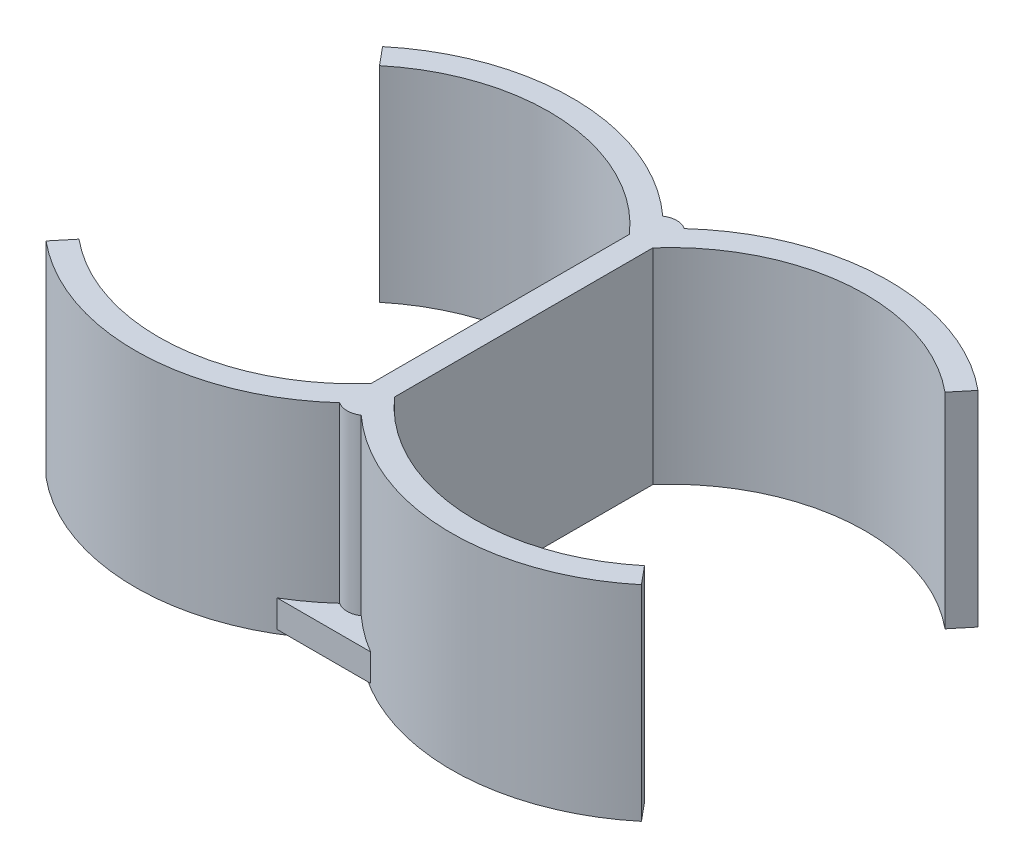
ISO-10303-21;
HEADER;
FILE_DESCRIPTION(('STEP AP214'),'2;1');
FILE_NAME('part.step','',(''),(''),'','','');
FILE_SCHEMA(('AUTOMOTIVE_DESIGN { 1 0 10303 214 1 1 1 1 }'));
ENDSEC;
DATA;
#1=APPLICATION_CONTEXT('core data for automotive mechanical design processes');
#2=APPLICATION_PROTOCOL_DEFINITION('international standard','automotive_design',2000,#1);
#3=PRODUCT_CONTEXT('',#1,'mechanical');
#4=PRODUCT('Part','Part','',(#3));
#5=PRODUCT_RELATED_PRODUCT_CATEGORY('part','',(#4));
#6=PRODUCT_DEFINITION_FORMATION('','',#4);
#7=PRODUCT_DEFINITION_CONTEXT('part definition',#1,'design');
#8=PRODUCT_DEFINITION('design','',#6,#7);
#9=PRODUCT_DEFINITION_SHAPE('','',#8);
#10=(LENGTH_UNIT() NAMED_UNIT(*) SI_UNIT(.MILLI.,.METRE.));
#11=(NAMED_UNIT(*) PLANE_ANGLE_UNIT() SI_UNIT($,.RADIAN.));
#12=(NAMED_UNIT(*) SI_UNIT($,.STERADIAN.) SOLID_ANGLE_UNIT());
#13=UNCERTAINTY_MEASURE_WITH_UNIT(LENGTH_MEASURE(1.E-05),#10,'distance_accuracy_value','');
#14=(GEOMETRIC_REPRESENTATION_CONTEXT(3) GLOBAL_UNCERTAINTY_ASSIGNED_CONTEXT((#13)) GLOBAL_UNIT_ASSIGNED_CONTEXT((#10,
#11,#12)) REPRESENTATION_CONTEXT('',''));
#15=CARTESIAN_POINT('',(0.,0.,0.));
#16=DIRECTION('',(0.,0.,1.));
#17=DIRECTION('',(1.,0.,0.));
#18=AXIS2_PLACEMENT_3D('',#15,#16,#17);
#19=CARTESIAN_POINT('',(-8.09945164662057,5.25,0.));
#20=DIRECTION('',(0.,-1.,0.));
#21=DIRECTION('',(0.,0.,-1.));
#22=AXIS2_PLACEMENT_3D('',#19,#20,#21);
#23=CYLINDRICAL_SURFACE('',#22,11.2);
#24=CARTESIAN_POINT('',(-8.09945164662057,-3.65,0.));
#25=DIRECTION('',(0.,-1.,0.));
#26=DIRECTION('',(0.,0.,-1.));
#27=AXIS2_PLACEMENT_3D('',#24,#25,#26);
#28=CIRCLE('',#27,11.2);
#29=CARTESIAN_POINT('',(-0.553184559306567,-3.65,8.27610131927597));
#30=VERTEX_POINT('',#29);
#31=CARTESIAN_POINT('',(-2.39016182000633,-3.65,9.6355596451747));
#32=VERTEX_POINT('',#31);
#33=EDGE_CURVE('E335',#30,#32,#28,.T.);
#34=ORIENTED_EDGE('',*,*,#33,.F.);
#35=DIRECTION('',(0.,1.,0.));
#36=VECTOR('',#35,1.);
#37=CARTESIAN_POINT('',(-0.553184559306565,0.799999999999999,8.27610131927596));
#38=LINE('',#37,#36);
#39=CARTESIAN_POINT('',(-0.553184559306565,5.25,8.27610131927596));
#40=VERTEX_POINT('',#39);
#41=EDGE_CURVE('E53',#30,#40,#38,.T.);
#42=ORIENTED_EDGE('',*,*,#41,.T.);
#43=CARTESIAN_POINT('',(-8.09945164662057,5.25,0.));
#44=DIRECTION('',(0.,1.,0.));
#45=DIRECTION('',(0.,0.,1.));
#46=AXIS2_PLACEMENT_3D('',#43,#44,#45);
#47=CIRCLE('',#46,11.2);
#48=CARTESIAN_POINT('',(-15.25,5.25,8.62030499727143));
#49=VERTEX_POINT('',#48);
#50=EDGE_CURVE('E311',#49,#40,#47,.T.);
#51=ORIENTED_EDGE('',*,*,#50,.F.);
#52=DIRECTION('',(0.,-1.,0.));
#53=VECTOR('',#52,1.);
#54=CARTESIAN_POINT('',(-15.25,5.25,8.62030499727143));
#55=LINE('',#54,#53);
#56=CARTESIAN_POINT('',(-15.25,-5.25,8.62030499727143));
#57=VERTEX_POINT('',#56);
#58=EDGE_CURVE('E220',#49,#57,#55,.T.);
#59=ORIENTED_EDGE('',*,*,#58,.T.);
#60=CARTESIAN_POINT('',(-8.09945164662057,-5.25,0.));
#61=DIRECTION('',(0.,1.,0.));
#62=DIRECTION('',(0.,0.,1.));
#63=AXIS2_PLACEMENT_3D('',#60,#61,#62);
#64=CIRCLE('',#63,11.2);
#65=CARTESIAN_POINT('',(0.,-5.25,7.7355596451747));
#66=VERTEX_POINT('',#65);
#67=EDGE_CURVE('E276',#57,#66,#64,.T.);
#68=ORIENTED_EDGE('',*,*,#67,.T.);
#69=DIRECTION('',(0.,-1.,0.));
#70=VECTOR('',#69,1.);
#71=CARTESIAN_POINT('',(0.,5.25,7.7355596451747));
#72=LINE('',#71,#70);
#73=CARTESIAN_POINT('',(0.,-5.05,7.7355596451747));
#74=VERTEX_POINT('',#73);
#75=EDGE_CURVE('E222',#74,#66,#72,.T.);
#76=ORIENTED_EDGE('',*,*,#75,.F.);
#77=CARTESIAN_POINT('',(-8.09945164662057,-5.05,0.));
#78=DIRECTION('',(0.,-1.,0.));
#79=DIRECTION('',(0.,0.,-1.));
#80=AXIS2_PLACEMENT_3D('',#77,#78,#79);
#81=CIRCLE('',#80,11.2);
#82=CARTESIAN_POINT('',(-2.39016182000633,-5.05,9.6355596451747));
#83=VERTEX_POINT('',#82);
#84=EDGE_CURVE('E339',#74,#83,#81,.T.);
#85=ORIENTED_EDGE('',*,*,#84,.T.);
#86=DIRECTION('',(0.,-1.,0.));
#87=VECTOR('',#86,1.);
#88=CARTESIAN_POINT('',(-2.39016182000633,-3.65,9.6355596451747));
#89=LINE('',#88,#87);
#90=EDGE_CURVE('E342',#32,#83,#89,.T.);
#91=ORIENTED_EDGE('',*,*,#90,.F.);
#92=EDGE_LOOP('',(#34,#42,#51,#59,#68,#76,#85,#91));
#93=FACE_BOUND('',#92,.T.);
#94=ADVANCED_FACE('F38',(#93),#23,.T.);
#95=CARTESIAN_POINT('',(8.09945164662057,5.25,0.));
#96=DIRECTION('',(0.,-1.,0.));
#97=DIRECTION('',(0.,0.,-1.));
#98=AXIS2_PLACEMENT_3D('',#95,#96,#97);
#99=CYLINDRICAL_SURFACE('',#98,11.2);
#100=CARTESIAN_POINT('',(8.09945164662057,5.25,0.));
#101=DIRECTION('',(0.,1.,0.));
#102=DIRECTION('',(0.,0.,1.));
#103=AXIS2_PLACEMENT_3D('',#100,#101,#102);
#104=CIRCLE('',#103,11.2);
#105=CARTESIAN_POINT('',(0.553184559306566,5.25,8.27610131927596));
#106=VERTEX_POINT('',#105);
#107=CARTESIAN_POINT('',(15.25,5.25,8.62030499727143));
#108=VERTEX_POINT('',#107);
#109=EDGE_CURVE('E198',#106,#108,#104,.T.);
#110=ORIENTED_EDGE('',*,*,#109,.F.);
#111=DIRECTION('',(0.,1.,0.));
#112=VECTOR('',#111,1.);
#113=CARTESIAN_POINT('',(0.553184559306566,0.799999999999999,8.27610131927596));
#114=LINE('',#113,#112);
#115=CARTESIAN_POINT('',(0.553184559306566,-3.65,8.27610131927596));
#116=VERTEX_POINT('',#115);
#117=EDGE_CURVE('E186',#106,#116,#114,.F.);
#118=ORIENTED_EDGE('',*,*,#117,.T.);
#119=CARTESIAN_POINT('',(8.09945164662057,-3.65,0.));
#120=DIRECTION('',(0.,-1.,0.));
#121=DIRECTION('',(0.,0.,-1.));
#122=AXIS2_PLACEMENT_3D('',#119,#120,#121);
#123=CIRCLE('',#122,11.2);
#124=CARTESIAN_POINT('',(2.39016182000634,-3.65,9.6355596451747));
#125=VERTEX_POINT('',#124);
#126=EDGE_CURVE('E196',#125,#116,#123,.T.);
#127=ORIENTED_EDGE('',*,*,#126,.F.);
#128=DIRECTION('',(0.,-1.,0.));
#129=VECTOR('',#128,1.);
#130=CARTESIAN_POINT('',(2.39016182000634,-3.65,9.6355596451747));
#131=LINE('',#130,#129);
#132=CARTESIAN_POINT('',(2.39016182000634,-5.05,9.6355596451747));
#133=VERTEX_POINT('',#132);
#134=EDGE_CURVE('E343',#125,#133,#131,.T.);
#135=ORIENTED_EDGE('',*,*,#134,.T.);
#136=CARTESIAN_POINT('',(8.09945164662057,-5.05,0.));
#137=DIRECTION('',(0.,-1.,0.));
#138=DIRECTION('',(0.,0.,-1.));
#139=AXIS2_PLACEMENT_3D('',#136,#137,#138);
#140=CIRCLE('',#139,11.2);
#141=EDGE_CURVE('E205',#133,#74,#140,.T.);
#142=ORIENTED_EDGE('',*,*,#141,.T.);
#143=ORIENTED_EDGE('',*,*,#75,.T.);
#144=CARTESIAN_POINT('',(8.09945164662057,-5.25,0.));
#145=DIRECTION('',(0.,1.,0.));
#146=DIRECTION('',(0.,0.,1.));
#147=AXIS2_PLACEMENT_3D('',#144,#145,#146);
#148=CIRCLE('',#147,11.2);
#149=CARTESIAN_POINT('',(15.25,-5.25,8.62030499727143));
#150=VERTEX_POINT('',#149);
#151=EDGE_CURVE('E274',#66,#150,#148,.T.);
#152=ORIENTED_EDGE('',*,*,#151,.T.);
#153=DIRECTION('',(0.,-1.,0.));
#154=VECTOR('',#153,1.);
#155=CARTESIAN_POINT('',(15.25,5.25,8.62030499727143));
#156=LINE('',#155,#154);
#157=EDGE_CURVE('E224',#108,#150,#156,.T.);
#158=ORIENTED_EDGE('',*,*,#157,.F.);
#159=EDGE_LOOP('',(#110,#118,#127,#135,#142,#143,#152,#158));
#160=FACE_BOUND('',#159,.T.);
#161=ADVANCED_FACE('F194',(#160),#99,.T.);
#162=CARTESIAN_POINT('',(-0.6,5.25,0.));
#163=DIRECTION('',(-1.,0.,0.));
#164=DIRECTION('',(0.,0.,1.));
#165=AXIS2_PLACEMENT_3D('',#162,#163,#164);
#166=PLANE('',#165);
#167=DIRECTION('',(0.,0.,-1.));
#168=VECTOR('',#167,1.);
#169=CARTESIAN_POINT('',(-0.6,-5.25,0.));
#170=LINE('',#169,#168);
#171=CARTESIAN_POINT('',(-0.6,-5.25,6.615));
#172=VERTEX_POINT('',#171);
#173=CARTESIAN_POINT('',(-0.6,-5.25,-6.615));
#174=VERTEX_POINT('',#173);
#175=EDGE_CURVE('E285',#172,#174,#170,.T.);
#176=ORIENTED_EDGE('',*,*,#175,.F.);
#177=DIRECTION('',(0.,-1.,0.));
#178=VECTOR('',#177,1.);
#179=CARTESIAN_POINT('',(-0.6,5.25,6.615));
#180=LINE('',#179,#178);
#181=CARTESIAN_POINT('',(-0.6,5.25,6.615));
#182=VERTEX_POINT('',#181);
#183=EDGE_CURVE('E216',#182,#172,#180,.T.);
#184=ORIENTED_EDGE('',*,*,#183,.F.);
#185=DIRECTION('',(0.,0.,-1.));
#186=VECTOR('',#185,1.);
#187=CARTESIAN_POINT('',(-0.6,5.25,0.));
#188=LINE('',#187,#186);
#189=CARTESIAN_POINT('',(-0.6,5.25,-6.615));
#190=VERTEX_POINT('',#189);
#191=EDGE_CURVE('E250',#182,#190,#188,.T.);
#192=ORIENTED_EDGE('',*,*,#191,.T.);
#193=DIRECTION('',(0.,-1.,0.));
#194=VECTOR('',#193,1.);
#195=CARTESIAN_POINT('',(-0.6,5.25,-6.615));
#196=LINE('',#195,#194);
#197=EDGE_CURVE('E244',#190,#174,#196,.T.);
#198=ORIENTED_EDGE('',*,*,#197,.T.);
#199=EDGE_LOOP('',(#176,#184,#192,#198));
#200=FACE_BOUND('',#199,.T.);
#201=ADVANCED_FACE('F40',(#200),#166,.T.);
#202=CARTESIAN_POINT('',(-8.09945164662057,5.25,0.));
#203=DIRECTION('',(0.,-1.,0.));
#204=DIRECTION('',(0.,0.,-1.));
#205=AXIS2_PLACEMENT_3D('',#202,#203,#204);
#206=CYLINDRICAL_SURFACE('',#205,10.);
#207=CARTESIAN_POINT('',(-8.09945164662057,5.25,0.));
#208=DIRECTION('',(0.,1.,0.));
#209=DIRECTION('',(0.,0.,1.));
#210=AXIS2_PLACEMENT_3D('',#207,#208,#209);
#211=CIRCLE('',#210,10.);
#212=CARTESIAN_POINT('',(-14.4838698192808,5.25,7.69670089042091));
#213=VERTEX_POINT('',#212);
#214=EDGE_CURVE('E317',#213,#182,#211,.T.);
#215=ORIENTED_EDGE('',*,*,#214,.T.);
#216=ORIENTED_EDGE('',*,*,#183,.T.);
#217=CARTESIAN_POINT('',(-8.09945164662057,-5.25,0.));
#218=DIRECTION('',(0.,1.,0.));
#219=DIRECTION('',(0.,0.,1.));
#220=AXIS2_PLACEMENT_3D('',#217,#218,#219);
#221=CIRCLE('',#220,10.);
#222=CARTESIAN_POINT('',(-14.4838698192808,-5.25,7.69670089042091));
#223=VERTEX_POINT('',#222);
#224=EDGE_CURVE('E282',#223,#172,#221,.T.);
#225=ORIENTED_EDGE('',*,*,#224,.F.);
#226=DIRECTION('',(0.,-1.,0.));
#227=VECTOR('',#226,1.);
#228=CARTESIAN_POINT('',(-14.4838698192808,5.25,7.69670089042091));
#229=LINE('',#228,#227);
#230=EDGE_CURVE('E218',#213,#223,#229,.T.);
#231=ORIENTED_EDGE('',*,*,#230,.F.);
#232=EDGE_LOOP('',(#215,#216,#225,#231));
#233=FACE_BOUND('',#232,.T.);
#234=ADVANCED_FACE('F433',(#233),#206,.F.);
#235=CARTESIAN_POINT('',(-4.79805073214482,5.25,-3.97998606464951));
#236=DIRECTION('',(-0.769670089042095,0.,-0.638441817266017));
#237=DIRECTION('',(-0.638441817266017,0.,0.769670089042095));
#238=AXIS2_PLACEMENT_3D('',#235,#236,#237);
#239=PLANE('',#238);
#240=DIRECTION('',(0.638441817266017,0.,-0.769670089042095));
#241=VECTOR('',#240,1.);
#242=CARTESIAN_POINT('',(-4.79805073214482,-5.25,-3.97998606464951));
#243=LINE('',#242,#241);
#244=EDGE_CURVE('E279',#57,#223,#243,.T.);
#245=ORIENTED_EDGE('',*,*,#244,.F.);
#246=ORIENTED_EDGE('',*,*,#58,.F.);
#247=DIRECTION('',(0.638441817266017,0.,-0.769670089042095));
#248=VECTOR('',#247,1.);
#249=CARTESIAN_POINT('',(-4.79805073214482,5.25,-3.97998606464951));
#250=LINE('',#249,#248);
#251=EDGE_CURVE('E314',#49,#213,#250,.T.);
#252=ORIENTED_EDGE('',*,*,#251,.T.);
#253=ORIENTED_EDGE('',*,*,#230,.T.);
#254=EDGE_LOOP('',(#245,#246,#252,#253));
#255=FACE_BOUND('',#254,.T.);
#256=ADVANCED_FACE('F435',(#255),#239,.T.);
#257=CARTESIAN_POINT('',(4.79805073214473,5.25,-3.97998606464948));
#258=DIRECTION('',(-0.769670089042091,0.,0.638441817266021));
#259=DIRECTION('',(0.638441817266021,0.,0.769670089042091));
#260=AXIS2_PLACEMENT_3D('',#257,#258,#259);
#261=PLANE('',#260);
#262=DIRECTION('',(-0.638441817266021,0.,-0.769670089042091));
#263=VECTOR('',#262,1.);
#264=CARTESIAN_POINT('',(4.79805073214473,-5.25,-3.97998606464948));
#265=LINE('',#264,#263);
#266=CARTESIAN_POINT('',(14.4838698192808,-5.25,7.69670089042092));
#267=VERTEX_POINT('',#266);
#268=EDGE_CURVE('E271',#150,#267,#265,.T.);
#269=ORIENTED_EDGE('',*,*,#268,.T.);
#270=DIRECTION('',(0.,-1.,0.));
#271=VECTOR('',#270,1.);
#272=CARTESIAN_POINT('',(14.4838698192808,5.25,7.69670089042092));
#273=LINE('',#272,#271);
#274=CARTESIAN_POINT('',(14.4838698192808,5.25,7.69670089042092));
#275=VERTEX_POINT('',#274);
#276=EDGE_CURVE('E227',#275,#267,#273,.T.);
#277=ORIENTED_EDGE('',*,*,#276,.F.);
#278=DIRECTION('',(-0.638441817266021,0.,-0.769670089042091));
#279=VECTOR('',#278,1.);
#280=CARTESIAN_POINT('',(4.79805073214473,5.25,-3.97998606464948));
#281=LINE('',#280,#279);
#282=EDGE_CURVE('E307',#108,#275,#281,.T.);
#283=ORIENTED_EDGE('',*,*,#282,.F.);
#284=ORIENTED_EDGE('',*,*,#157,.T.);
#285=EDGE_LOOP('',(#269,#277,#283,#284));
#286=FACE_BOUND('',#285,.T.);
#287=ADVANCED_FACE('F377',(#286),#261,.F.);
#288=CARTESIAN_POINT('',(8.09945164662057,5.25,0.));
#289=DIRECTION('',(0.,-1.,0.));
#290=DIRECTION('',(0.,0.,-1.));
#291=AXIS2_PLACEMENT_3D('',#288,#289,#290);
#292=CYLINDRICAL_SURFACE('',#291,9.99999999999999);
#293=CARTESIAN_POINT('',(8.09945164662057,5.25,0.));
#294=DIRECTION('',(0.,1.,0.));
#295=DIRECTION('',(0.,0.,1.));
#296=AXIS2_PLACEMENT_3D('',#293,#294,#295);
#297=CIRCLE('',#296,9.99999999999999);
#298=CARTESIAN_POINT('',(0.6,5.25,6.615));
#299=VERTEX_POINT('',#298);
#300=EDGE_CURVE('E305',#299,#275,#297,.T.);
#301=ORIENTED_EDGE('',*,*,#300,.T.);
#302=ORIENTED_EDGE('',*,*,#276,.T.);
#303=CARTESIAN_POINT('',(8.09945164662057,-5.25,0.));
#304=DIRECTION('',(0.,1.,0.));
#305=DIRECTION('',(0.,0.,1.));
#306=AXIS2_PLACEMENT_3D('',#303,#304,#305);
#307=CIRCLE('',#306,9.99999999999999);
#308=CARTESIAN_POINT('',(0.6,-5.25,6.615));
#309=VERTEX_POINT('',#308);
#310=EDGE_CURVE('E268',#309,#267,#307,.T.);
#311=ORIENTED_EDGE('',*,*,#310,.F.);
#312=DIRECTION('',(0.,-1.,0.));
#313=VECTOR('',#312,1.);
#314=CARTESIAN_POINT('',(0.6,5.25,6.615));
#315=LINE('',#314,#313);
#316=EDGE_CURVE('E229',#299,#309,#315,.T.);
#317=ORIENTED_EDGE('',*,*,#316,.F.);
#318=EDGE_LOOP('',(#301,#302,#311,#317));
#319=FACE_BOUND('',#318,.T.);
#320=ADVANCED_FACE('F384',(#319),#292,.F.);
#321=CARTESIAN_POINT('',(0.6,5.25,0.));
#322=DIRECTION('',(-1.,0.,0.));
#323=DIRECTION('',(0.,0.,1.));
#324=AXIS2_PLACEMENT_3D('',#321,#322,#323);
#325=PLANE('',#324);
#326=DIRECTION('',(0.,0.,-1.));
#327=VECTOR('',#326,1.);
#328=CARTESIAN_POINT('',(0.6,-5.25,0.));
#329=LINE('',#328,#327);
#330=CARTESIAN_POINT('',(0.6,-5.25,-6.615));
#331=VERTEX_POINT('',#330);
#332=EDGE_CURVE('E265',#309,#331,#329,.T.);
#333=ORIENTED_EDGE('',*,*,#332,.T.);
#334=DIRECTION('',(0.,-1.,0.));
#335=VECTOR('',#334,1.);
#336=CARTESIAN_POINT('',(0.6,5.25,-6.615));
#337=LINE('',#336,#335);
#338=CARTESIAN_POINT('',(0.6,5.25,-6.615));
#339=VERTEX_POINT('',#338);
#340=EDGE_CURVE('E231',#339,#331,#337,.T.);
#341=ORIENTED_EDGE('',*,*,#340,.F.);
#342=DIRECTION('',(0.,0.,-1.));
#343=VECTOR('',#342,1.);
#344=CARTESIAN_POINT('',(0.6,5.25,0.));
#345=LINE('',#344,#343);
#346=EDGE_CURVE('E302',#299,#339,#345,.T.);
#347=ORIENTED_EDGE('',*,*,#346,.F.);
#348=ORIENTED_EDGE('',*,*,#316,.T.);
#349=EDGE_LOOP('',(#333,#341,#347,#348));
#350=FACE_BOUND('',#349,.T.);
#351=ADVANCED_FACE('F388',(#350),#325,.F.);
#352=CARTESIAN_POINT('',(8.09945164662057,5.25,0.));
#353=DIRECTION('',(0.,-1.,0.));
#354=DIRECTION('',(0.,0.,-1.));
#355=AXIS2_PLACEMENT_3D('',#352,#353,#354);
#356=CYLINDRICAL_SURFACE('',#355,9.99999999999999);
#357=CARTESIAN_POINT('',(8.09945164662057,5.25,0.));
#358=DIRECTION('',(0.,1.,0.));
#359=DIRECTION('',(0.,0.,1.));
#360=AXIS2_PLACEMENT_3D('',#357,#358,#359);
#361=CIRCLE('',#360,9.99999999999999);
#362=CARTESIAN_POINT('',(14.4838698192808,5.25,-7.69670089042092));
#363=VERTEX_POINT('',#362);
#364=EDGE_CURVE('E300',#363,#339,#361,.T.);
#365=ORIENTED_EDGE('',*,*,#364,.T.);
#366=ORIENTED_EDGE('',*,*,#340,.T.);
#367=CARTESIAN_POINT('',(8.09945164662057,-5.25,0.));
#368=DIRECTION('',(0.,1.,0.));
#369=DIRECTION('',(0.,0.,1.));
#370=AXIS2_PLACEMENT_3D('',#367,#368,#369);
#371=CIRCLE('',#370,9.99999999999999);
#372=CARTESIAN_POINT('',(14.4838698192808,-5.25,-7.69670089042092));
#373=VERTEX_POINT('',#372);
#374=EDGE_CURVE('E262',#373,#331,#371,.T.);
#375=ORIENTED_EDGE('',*,*,#374,.F.);
#376=DIRECTION('',(0.,-1.,0.));
#377=VECTOR('',#376,1.);
#378=CARTESIAN_POINT('',(14.4838698192808,5.25,-7.69670089042092));
#379=LINE('',#378,#377);
#380=EDGE_CURVE('E233',#363,#373,#379,.T.);
#381=ORIENTED_EDGE('',*,*,#380,.F.);
#382=EDGE_LOOP('',(#365,#366,#375,#381));
#383=FACE_BOUND('',#382,.T.);
#384=ADVANCED_FACE('F391',(#383),#356,.F.);
#385=CARTESIAN_POINT('',(4.79805073214471,5.25,3.97998606464947));
#386=DIRECTION('',(0.76967008904209,0.,0.638441817266022));
#387=DIRECTION('',(0.638441817266022,0.,-0.76967008904209));
#388=AXIS2_PLACEMENT_3D('',#385,#386,#387);
#389=PLANE('',#388);
#390=DIRECTION('',(-0.638441817266022,0.,0.76967008904209));
#391=VECTOR('',#390,1.);
#392=CARTESIAN_POINT('',(4.79805073214471,-5.25,3.97998606464947));
#393=LINE('',#392,#391);
#394=CARTESIAN_POINT('',(15.25,-5.25,-8.62030499727143));
#395=VERTEX_POINT('',#394);
#396=EDGE_CURVE('E259',#395,#373,#393,.T.);
#397=ORIENTED_EDGE('',*,*,#396,.F.);
#398=DIRECTION('',(0.,-1.,0.));
#399=VECTOR('',#398,1.);
#400=CARTESIAN_POINT('',(15.25,5.25,-8.62030499727143));
#401=LINE('',#400,#399);
#402=CARTESIAN_POINT('',(15.25,5.25,-8.62030499727143));
#403=VERTEX_POINT('',#402);
#404=EDGE_CURVE('E235',#403,#395,#401,.T.);
#405=ORIENTED_EDGE('',*,*,#404,.F.);
#406=DIRECTION('',(-0.638441817266022,0.,0.76967008904209));
#407=VECTOR('',#406,1.);
#408=CARTESIAN_POINT('',(4.79805073214471,5.25,3.97998606464947));
#409=LINE('',#408,#407);
#410=EDGE_CURVE('E297',#403,#363,#409,.T.);
#411=ORIENTED_EDGE('',*,*,#410,.T.);
#412=ORIENTED_EDGE('',*,*,#380,.T.);
#413=EDGE_LOOP('',(#397,#405,#411,#412));
#414=FACE_BOUND('',#413,.T.);
#415=ADVANCED_FACE('F395',(#414),#389,.T.);
#416=CARTESIAN_POINT('',(8.09945164662057,5.25,0.));
#417=DIRECTION('',(0.,-1.,0.));
#418=DIRECTION('',(0.,0.,-1.));
#419=AXIS2_PLACEMENT_3D('',#416,#417,#418);
#420=CYLINDRICAL_SURFACE('',#419,11.2);
#421=CARTESIAN_POINT('',(8.09945164662057,-3.65,0.));
#422=DIRECTION('',(0.,1.,0.));
#423=DIRECTION('',(0.,0.,1.));
#424=AXIS2_PLACEMENT_3D('',#421,#422,#423);
#425=CIRCLE('',#424,11.2);
#426=CARTESIAN_POINT('',(2.39016182000634,-3.65,-9.6355596451747));
#427=VERTEX_POINT('',#426);
#428=CARTESIAN_POINT('',(0.553184559306568,-3.65,-8.27610131927597));
#429=VERTEX_POINT('',#428);
#430=EDGE_CURVE('E288',#427,#429,#425,.T.);
#431=ORIENTED_EDGE('',*,*,#430,.T.);
#432=DIRECTION('',(0.,1.,0.));
#433=VECTOR('',#432,1.);
#434=CARTESIAN_POINT('',(0.553184559306564,0.799999999999999,-8.27610131927596));
#435=LINE('',#434,#433);
#436=CARTESIAN_POINT('',(0.553184559306568,5.25,-8.27610131927597));
#437=VERTEX_POINT('',#436);
#438=EDGE_CURVE('E349',#429,#437,#435,.T.);
#439=ORIENTED_EDGE('',*,*,#438,.T.);
#440=CARTESIAN_POINT('',(8.09945164662057,5.25,0.));
#441=DIRECTION('',(0.,1.,0.));
#442=DIRECTION('',(0.,0.,1.));
#443=AXIS2_PLACEMENT_3D('',#440,#441,#442);
#444=CIRCLE('',#443,11.2);
#445=EDGE_CURVE('E294',#403,#437,#444,.T.);
#446=ORIENTED_EDGE('',*,*,#445,.F.);
#447=ORIENTED_EDGE('',*,*,#404,.T.);
#448=CARTESIAN_POINT('',(8.09945164662057,-5.25,0.));
#449=DIRECTION('',(0.,1.,0.));
#450=DIRECTION('',(0.,0.,1.));
#451=AXIS2_PLACEMENT_3D('',#448,#449,#450);
#452=CIRCLE('',#451,11.2);
#453=CARTESIAN_POINT('',(0.,-5.25,-7.7355596451747));
#454=VERTEX_POINT('',#453);
#455=EDGE_CURVE('E256',#395,#454,#452,.T.);
#456=ORIENTED_EDGE('',*,*,#455,.T.);
#457=DIRECTION('',(0.,-1.,0.));
#458=VECTOR('',#457,1.);
#459=CARTESIAN_POINT('',(0.,5.25,-7.7355596451747));
#460=LINE('',#459,#458);
#461=CARTESIAN_POINT('',(0.,-5.05,-7.7355596451747));
#462=VERTEX_POINT('',#461);
#463=EDGE_CURVE('E237',#462,#454,#460,.T.);
#464=ORIENTED_EDGE('',*,*,#463,.F.);
#465=CARTESIAN_POINT('',(8.09945164662057,-5.05,0.));
#466=DIRECTION('',(0.,1.,0.));
#467=DIRECTION('',(0.,0.,1.));
#468=AXIS2_PLACEMENT_3D('',#465,#466,#467);
#469=CIRCLE('',#468,11.2);
#470=CARTESIAN_POINT('',(2.39016182000631,-5.05,-9.63555964517469));
#471=VERTEX_POINT('',#470);
#472=EDGE_CURVE('E323',#471,#462,#469,.T.);
#473=ORIENTED_EDGE('',*,*,#472,.F.);
#474=DIRECTION('',(0.,-1.,0.));
#475=VECTOR('',#474,1.);
#476=CARTESIAN_POINT('',(2.39016182000634,-3.65,-9.6355596451747));
#477=LINE('',#476,#475);
#478=EDGE_CURVE('E326',#427,#471,#477,.T.);
#479=ORIENTED_EDGE('',*,*,#478,.F.);
#480=EDGE_LOOP('',(#431,#439,#446,#447,#456,#464,#473,#479));
#481=FACE_BOUND('',#480,.T.);
#482=ADVANCED_FACE('F399',(#481),#420,.T.);
#483=CARTESIAN_POINT('',(-8.09945164662057,5.25,0.));
#484=DIRECTION('',(0.,-1.,0.));
#485=DIRECTION('',(0.,0.,-1.));
#486=AXIS2_PLACEMENT_3D('',#483,#484,#485);
#487=CYLINDRICAL_SURFACE('',#486,11.2);
#488=CARTESIAN_POINT('',(-8.09945164662057,5.25,0.));
#489=DIRECTION('',(0.,1.,0.));
#490=DIRECTION('',(0.,0.,1.));
#491=AXIS2_PLACEMENT_3D('',#488,#489,#490);
#492=CIRCLE('',#491,11.2);
#493=CARTESIAN_POINT('',(-0.553184559306567,5.25,-8.27610131927596));
#494=VERTEX_POINT('',#493);
#495=CARTESIAN_POINT('',(-15.25,5.25,-8.62030499727143));
#496=VERTEX_POINT('',#495);
#497=EDGE_CURVE('E60',#494,#496,#492,.T.);
#498=ORIENTED_EDGE('',*,*,#497,.F.);
#499=DIRECTION('',(0.,1.,0.));
#500=VECTOR('',#499,1.);
#501=CARTESIAN_POINT('',(-0.553184559306565,0.799999999999999,-8.27610131927596));
#502=LINE('',#501,#500);
#503=CARTESIAN_POINT('',(-0.553184559306566,-3.65,-8.27610131927596));
#504=VERTEX_POINT('',#503);
#505=EDGE_CURVE('E352',#494,#504,#502,.F.);
#506=ORIENTED_EDGE('',*,*,#505,.T.);
#507=CARTESIAN_POINT('',(-8.09945164662057,-3.65,0.));
#508=DIRECTION('',(0.,1.,0.));
#509=DIRECTION('',(0.,0.,1.));
#510=AXIS2_PLACEMENT_3D('',#507,#508,#509);
#511=CIRCLE('',#510,11.2);
#512=CARTESIAN_POINT('',(-2.39016182000634,-3.65,-9.6355596451747));
#513=VERTEX_POINT('',#512);
#514=EDGE_CURVE('E209',#504,#513,#511,.T.);
#515=ORIENTED_EDGE('',*,*,#514,.T.);
#516=DIRECTION('',(0.,-1.,0.));
#517=VECTOR('',#516,1.);
#518=CARTESIAN_POINT('',(-2.39016182000633,-3.65,-9.6355596451747));
#519=LINE('',#518,#517);
#520=CARTESIAN_POINT('',(-2.39016182000633,-5.05,-9.6355596451747));
#521=VERTEX_POINT('',#520);
#522=EDGE_CURVE('E327',#513,#521,#519,.T.);
#523=ORIENTED_EDGE('',*,*,#522,.T.);
#524=CARTESIAN_POINT('',(-8.09945164662057,-5.05,0.));
#525=DIRECTION('',(0.,1.,0.));
#526=DIRECTION('',(0.,0.,1.));
#527=AXIS2_PLACEMENT_3D('',#524,#525,#526);
#528=CIRCLE('',#527,11.2);
#529=EDGE_CURVE('E213',#462,#521,#528,.T.);
#530=ORIENTED_EDGE('',*,*,#529,.F.);
#531=ORIENTED_EDGE('',*,*,#463,.T.);
#532=CARTESIAN_POINT('',(-8.09945164662057,-5.25,0.));
#533=DIRECTION('',(0.,1.,0.));
#534=DIRECTION('',(0.,0.,1.));
#535=AXIS2_PLACEMENT_3D('',#532,#533,#534);
#536=CIRCLE('',#535,11.2);
#537=CARTESIAN_POINT('',(-15.25,-5.25,-8.62030499727143));
#538=VERTEX_POINT('',#537);
#539=EDGE_CURVE('E254',#454,#538,#536,.T.);
#540=ORIENTED_EDGE('',*,*,#539,.T.);
#541=DIRECTION('',(0.,-1.,0.));
#542=VECTOR('',#541,1.);
#543=CARTESIAN_POINT('',(-15.25,5.25,-8.62030499727143));
#544=LINE('',#543,#542);
#545=EDGE_CURVE('E239',#496,#538,#544,.T.);
#546=ORIENTED_EDGE('',*,*,#545,.F.);
#547=EDGE_LOOP('',(#498,#506,#515,#523,#530,#531,#540,#546));
#548=FACE_BOUND('',#547,.T.);
#549=ADVANCED_FACE('F404',(#548),#487,.T.);
#550=CARTESIAN_POINT('',(-4.79805073214476,5.25,3.97998606464949));
#551=DIRECTION('',(0.769670089042092,0.,-0.63844181726602));
#552=DIRECTION('',(-0.63844181726602,0.,-0.769670089042092));
#553=AXIS2_PLACEMENT_3D('',#550,#551,#552);
#554=PLANE('',#553);
#555=DIRECTION('',(0.63844181726602,0.,0.769670089042092));
#556=VECTOR('',#555,1.);
#557=CARTESIAN_POINT('',(-4.79805073214476,-5.25,3.97998606464949));
#558=LINE('',#557,#556);
#559=CARTESIAN_POINT('',(-14.4838698192808,-5.25,-7.69670089042092));
#560=VERTEX_POINT('',#559);
#561=EDGE_CURVE('E251',#538,#560,#558,.T.);
#562=ORIENTED_EDGE('',*,*,#561,.T.);
#563=DIRECTION('',(0.,-1.,0.));
#564=VECTOR('',#563,1.);
#565=CARTESIAN_POINT('',(-14.4838698192808,5.25,-7.69670089042092));
#566=LINE('',#565,#564);
#567=CARTESIAN_POINT('',(-14.4838698192808,5.25,-7.69670089042092));
#568=VERTEX_POINT('',#567);
#569=EDGE_CURVE('E242',#568,#560,#566,.T.);
#570=ORIENTED_EDGE('',*,*,#569,.F.);
#571=DIRECTION('',(0.63844181726602,0.,0.769670089042092));
#572=VECTOR('',#571,1.);
#573=CARTESIAN_POINT('',(-4.79805073214476,5.25,3.97998606464949));
#574=LINE('',#573,#572);
#575=EDGE_CURVE('E290',#496,#568,#574,.T.);
#576=ORIENTED_EDGE('',*,*,#575,.F.);
#577=ORIENTED_EDGE('',*,*,#545,.T.);
#578=EDGE_LOOP('',(#562,#570,#576,#577));
#579=FACE_BOUND('',#578,.T.);
#580=ADVANCED_FACE('F420',(#579),#554,.F.);
#581=CARTESIAN_POINT('',(-8.09945164662057,5.25,0.));
#582=DIRECTION('',(0.,-1.,0.));
#583=DIRECTION('',(0.,0.,-1.));
#584=AXIS2_PLACEMENT_3D('',#581,#582,#583);
#585=CYLINDRICAL_SURFACE('',#584,10.);
#586=CARTESIAN_POINT('',(-8.09945164662057,5.25,0.));
#587=DIRECTION('',(0.,1.,0.));
#588=DIRECTION('',(0.,0.,1.));
#589=AXIS2_PLACEMENT_3D('',#586,#587,#588);
#590=CIRCLE('',#589,10.);
#591=EDGE_CURVE('E246',#190,#568,#590,.T.);
#592=ORIENTED_EDGE('',*,*,#591,.T.);
#593=ORIENTED_EDGE('',*,*,#569,.T.);
#594=CARTESIAN_POINT('',(-8.09945164662057,-5.25,0.));
#595=DIRECTION('',(0.,1.,0.));
#596=DIRECTION('',(0.,0.,1.));
#597=AXIS2_PLACEMENT_3D('',#594,#595,#596);
#598=CIRCLE('',#597,10.);
#599=EDGE_CURVE('E247',#174,#560,#598,.T.);
#600=ORIENTED_EDGE('',*,*,#599,.F.);
#601=ORIENTED_EDGE('',*,*,#197,.F.);
#602=EDGE_LOOP('',(#592,#593,#600,#601));
#603=FACE_BOUND('',#602,.T.);
#604=ADVANCED_FACE('F426',(#603),#585,.F.);
#605=CARTESIAN_POINT('',(0.,5.25,0.));
#606=DIRECTION('',(0.,1.,0.));
#607=DIRECTION('',(0.,0.,1.));
#608=AXIS2_PLACEMENT_3D('',#605,#606,#607);
#609=PLANE('',#608);
#610=ORIENTED_EDGE('',*,*,#50,.T.);
#611=CARTESIAN_POINT('',(0.,5.25,7.44304259184746));
#612=DIRECTION('',(0.,1.,0.));
#613=DIRECTION('',(0.,0.,1.));
#614=AXIS2_PLACEMENT_3D('',#611,#612,#613);
#615=CIRCLE('',#614,1.);
#616=EDGE_CURVE('E199',#40,#106,#615,.T.);
#617=ORIENTED_EDGE('',*,*,#616,.T.);
#618=ORIENTED_EDGE('',*,*,#109,.T.);
#619=ORIENTED_EDGE('',*,*,#282,.T.);
#620=ORIENTED_EDGE('',*,*,#300,.F.);
#621=ORIENTED_EDGE('',*,*,#346,.T.);
#622=ORIENTED_EDGE('',*,*,#364,.F.);
#623=ORIENTED_EDGE('',*,*,#410,.F.);
#624=ORIENTED_EDGE('',*,*,#445,.T.);
#625=CARTESIAN_POINT('',(0.,5.25,-7.44304259184745));
#626=DIRECTION('',(0.,1.,0.));
#627=DIRECTION('',(0.,0.,1.));
#628=AXIS2_PLACEMENT_3D('',#625,#626,#627);
#629=CIRCLE('',#628,1.);
#630=EDGE_CURVE('E354',#437,#494,#629,.T.);
#631=ORIENTED_EDGE('',*,*,#630,.T.);
#632=ORIENTED_EDGE('',*,*,#497,.T.);
#633=ORIENTED_EDGE('',*,*,#575,.T.);
#634=ORIENTED_EDGE('',*,*,#591,.F.);
#635=ORIENTED_EDGE('',*,*,#191,.F.);
#636=ORIENTED_EDGE('',*,*,#214,.F.);
#637=ORIENTED_EDGE('',*,*,#251,.F.);
#638=EDGE_LOOP('',(#610,#617,#618,#619,#620,#621,#622,#623,#624,#631,#632,#633,#634,#635,#636,#637));
#639=FACE_BOUND('',#638,.T.);
#640=ADVANCED_FACE('F359',(#639),#609,.T.);
#641=CARTESIAN_POINT('',(0.,-5.25,0.));
#642=DIRECTION('',(0.,1.,0.));
#643=DIRECTION('',(0.,0.,1.));
#644=AXIS2_PLACEMENT_3D('',#641,#642,#643);
#645=PLANE('',#644);
#646=ORIENTED_EDGE('',*,*,#175,.T.);
#647=ORIENTED_EDGE('',*,*,#599,.T.);
#648=ORIENTED_EDGE('',*,*,#561,.F.);
#649=ORIENTED_EDGE('',*,*,#539,.F.);
#650=ORIENTED_EDGE('',*,*,#455,.F.);
#651=ORIENTED_EDGE('',*,*,#396,.T.);
#652=ORIENTED_EDGE('',*,*,#374,.T.);
#653=ORIENTED_EDGE('',*,*,#332,.F.);
#654=ORIENTED_EDGE('',*,*,#310,.T.);
#655=ORIENTED_EDGE('',*,*,#268,.F.);
#656=ORIENTED_EDGE('',*,*,#151,.F.);
#657=ORIENTED_EDGE('',*,*,#67,.F.);
#658=ORIENTED_EDGE('',*,*,#244,.T.);
#659=ORIENTED_EDGE('',*,*,#224,.T.);
#660=EDGE_LOOP('',(#646,#647,#648,#649,#650,#651,#652,#653,#654,#655,#656,#657,#658,#659));
#661=FACE_BOUND('',#660,.T.);
#662=ADVANCED_FACE('F374',(#661),#645,.F.);
#663=CARTESIAN_POINT('',(2.39016182000634,-3.65,-9.6355596451747));
#664=DIRECTION('',(0.,0.,-1.));
#665=DIRECTION('',(-1.,0.,0.));
#666=AXIS2_PLACEMENT_3D('',#663,#664,#665);
#667=PLANE('',#666);
#668=DIRECTION('',(1.,0.,0.));
#669=VECTOR('',#668,1.);
#670=CARTESIAN_POINT('',(2.39016182000634,-5.05,-9.6355596451747));
#671=LINE('',#670,#669);
#672=EDGE_CURVE('E332',#521,#471,#671,.T.);
#673=ORIENTED_EDGE('',*,*,#672,.F.);
#674=ORIENTED_EDGE('',*,*,#522,.F.);
#675=DIRECTION('',(1.,0.,0.));
#676=VECTOR('',#675,1.);
#677=CARTESIAN_POINT('',(2.39016182000634,-3.65,-9.6355596451747));
#678=LINE('',#677,#676);
#679=EDGE_CURVE('E329',#513,#427,#678,.T.);
#680=ORIENTED_EDGE('',*,*,#679,.T.);
#681=ORIENTED_EDGE('',*,*,#478,.T.);
#682=EDGE_LOOP('',(#673,#674,#680,#681));
#683=FACE_BOUND('',#682,.T.);
#684=ADVANCED_FACE('F410',(#683),#667,.T.);
#685=CARTESIAN_POINT('',(0.,-3.65,0.));
#686=DIRECTION('',(0.,1.,0.));
#687=DIRECTION('',(0.,0.,1.));
#688=AXIS2_PLACEMENT_3D('',#685,#686,#687);
#689=PLANE('',#688);
#690=CARTESIAN_POINT('',(0.,-3.65,-7.44304259184745));
#691=DIRECTION('',(0.,1.,0.));
#692=DIRECTION('',(0.,0.,1.));
#693=AXIS2_PLACEMENT_3D('',#690,#691,#692);
#694=CIRCLE('',#693,1.);
#695=EDGE_CURVE('E46',#429,#504,#694,.T.);
#696=ORIENTED_EDGE('',*,*,#695,.F.);
#697=ORIENTED_EDGE('',*,*,#430,.F.);
#698=ORIENTED_EDGE('',*,*,#679,.F.);
#699=ORIENTED_EDGE('',*,*,#514,.F.);
#700=EDGE_LOOP('',(#696,#697,#698,#699));
#701=FACE_BOUND('',#700,.T.);
#702=ADVANCED_FACE('F412',(#701),#689,.T.);
#703=CARTESIAN_POINT('',(0.,-5.05,0.));
#704=DIRECTION('',(0.,1.,0.));
#705=DIRECTION('',(0.,0.,1.));
#706=AXIS2_PLACEMENT_3D('',#703,#704,#705);
#707=PLANE('',#706);
#708=ORIENTED_EDGE('',*,*,#672,.T.);
#709=ORIENTED_EDGE('',*,*,#472,.T.);
#710=ORIENTED_EDGE('',*,*,#529,.T.);
#711=EDGE_LOOP('',(#708,#709,#710));
#712=FACE_BOUND('',#711,.T.);
#713=ADVANCED_FACE('F415',(#712),#707,.F.);
#714=CARTESIAN_POINT('',(2.39016182000634,-3.65,9.6355596451747));
#715=DIRECTION('',(0.,0.,1.));
#716=DIRECTION('',(1.,0.,0.));
#717=AXIS2_PLACEMENT_3D('',#714,#715,#716);
#718=PLANE('',#717);
#719=DIRECTION('',(-1.,0.,0.));
#720=VECTOR('',#719,1.);
#721=CARTESIAN_POINT('',(2.39016182000634,-5.05,9.6355596451747));
#722=LINE('',#721,#720);
#723=EDGE_CURVE('E346',#133,#83,#722,.T.);
#724=ORIENTED_EDGE('',*,*,#723,.F.);
#725=ORIENTED_EDGE('',*,*,#134,.F.);
#726=DIRECTION('',(-1.,0.,0.));
#727=VECTOR('',#726,1.);
#728=CARTESIAN_POINT('',(2.39016182000634,-3.65,9.6355596451747));
#729=LINE('',#728,#727);
#730=EDGE_CURVE('E204',#125,#32,#729,.T.);
#731=ORIENTED_EDGE('',*,*,#730,.T.);
#732=ORIENTED_EDGE('',*,*,#90,.T.);
#733=EDGE_LOOP('',(#724,#725,#731,#732));
#734=FACE_BOUND('',#733,.T.);
#735=ADVANCED_FACE('F366',(#734),#718,.T.);
#736=CARTESIAN_POINT('',(0.,-3.65,0.));
#737=DIRECTION('',(0.,-1.,0.));
#738=DIRECTION('',(0.,0.,-1.));
#739=AXIS2_PLACEMENT_3D('',#736,#737,#738);
#740=PLANE('',#739);
#741=ORIENTED_EDGE('',*,*,#126,.T.);
#742=CARTESIAN_POINT('',(0.,-3.65,7.44304259184746));
#743=DIRECTION('',(0.,-1.,0.));
#744=DIRECTION('',(0.,0.,-1.));
#745=AXIS2_PLACEMENT_3D('',#742,#743,#744);
#746=CIRCLE('',#745,1.);
#747=EDGE_CURVE('E11',#116,#30,#746,.T.);
#748=ORIENTED_EDGE('',*,*,#747,.T.);
#749=ORIENTED_EDGE('',*,*,#33,.T.);
#750=ORIENTED_EDGE('',*,*,#730,.F.);
#751=EDGE_LOOP('',(#741,#748,#749,#750));
#752=FACE_BOUND('',#751,.T.);
#753=ADVANCED_FACE('F202',(#752),#740,.F.);
#754=CARTESIAN_POINT('',(0.,-5.05,0.));
#755=DIRECTION('',(0.,-1.,0.));
#756=DIRECTION('',(0.,0.,-1.));
#757=AXIS2_PLACEMENT_3D('',#754,#755,#756);
#758=PLANE('',#757);
#759=ORIENTED_EDGE('',*,*,#84,.F.);
#760=ORIENTED_EDGE('',*,*,#141,.F.);
#761=ORIENTED_EDGE('',*,*,#723,.T.);
#762=EDGE_LOOP('',(#759,#760,#761));
#763=FACE_BOUND('',#762,.T.);
#764=ADVANCED_FACE('F478',(#763),#758,.T.);
#765=CARTESIAN_POINT('',(0.,-6.4784271247462,-7.44304259184745));
#766=DIRECTION('',(0.,1.,0.));
#767=DIRECTION('',(0.,0.,1.));
#768=AXIS2_PLACEMENT_3D('',#765,#766,#767);
#769=CYLINDRICAL_SURFACE('',#768,1.);
#770=ORIENTED_EDGE('',*,*,#438,.F.);
#771=ORIENTED_EDGE('',*,*,#695,.T.);
#772=ORIENTED_EDGE('',*,*,#505,.F.);
#773=ORIENTED_EDGE('',*,*,#630,.F.);
#774=EDGE_LOOP('',(#770,#771,#772,#773));
#775=FACE_BOUND('',#774,.T.);
#776=ADVANCED_FACE('F403',(#775),#769,.T.);
#777=CARTESIAN_POINT('',(0.,-6.4784271247462,7.44304259184746));
#778=DIRECTION('',(0.,1.,0.));
#779=DIRECTION('',(0.,0.,1.));
#780=AXIS2_PLACEMENT_3D('',#777,#778,#779);
#781=CYLINDRICAL_SURFACE('',#780,1.);
#782=ORIENTED_EDGE('',*,*,#41,.F.);
#783=ORIENTED_EDGE('',*,*,#747,.F.);
#784=ORIENTED_EDGE('',*,*,#117,.F.);
#785=ORIENTED_EDGE('',*,*,#616,.F.);
#786=EDGE_LOOP('',(#782,#783,#784,#785));
#787=FACE_BOUND('',#786,.T.);
#788=ADVANCED_FACE('F185',(#787),#781,.T.);
#789=CLOSED_SHELL('',(#94,#161,#201,#234,#256,#287,#320,#351,#384,#415,#482,#549,#580,#604,#640,
#662,#684,#702,#713,#735,#753,#764,#776,#788));
#790=MANIFOLD_SOLID_BREP('B2',#789);
#791=ADVANCED_BREP_SHAPE_REPRESENTATION('',(#18,#790),#14);
#792=SHAPE_DEFINITION_REPRESENTATION(#9,#791);
ENDSEC;
END-ISO-10303-21;
